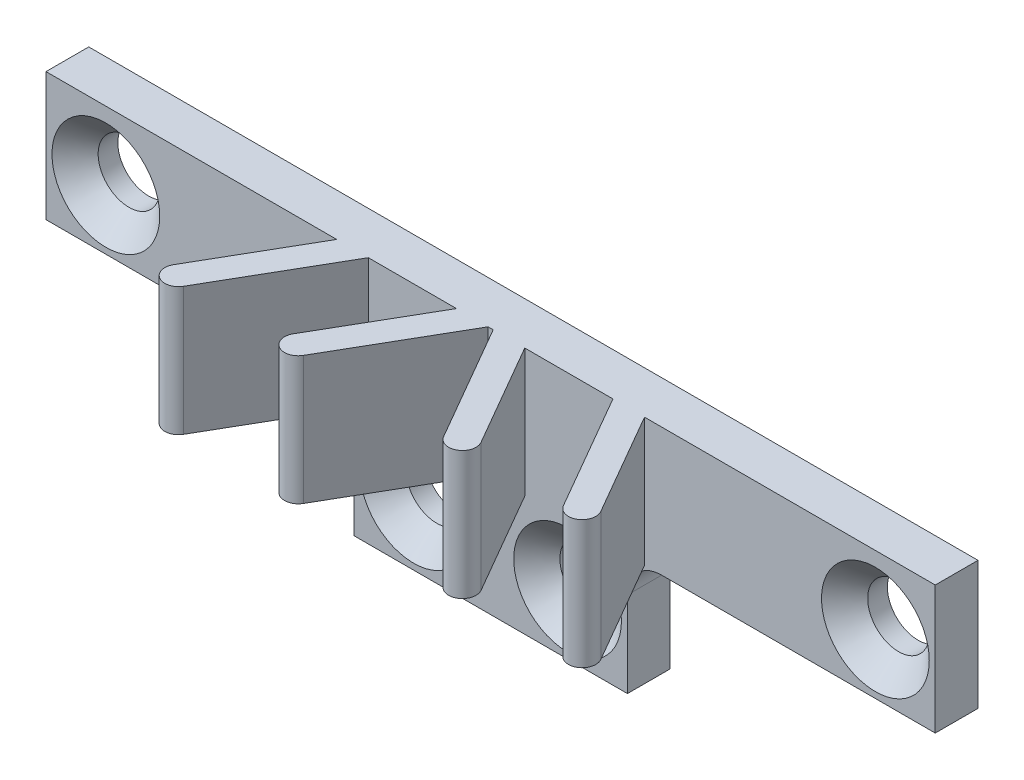
ISO-10303-21;
HEADER;
FILE_DESCRIPTION(('STEP AP214'),'2;1');
FILE_NAME('part.step','',(''),(''),'','','');
FILE_SCHEMA(('AUTOMOTIVE_DESIGN { 1 0 10303 214 1 1 1 1 }'));
ENDSEC;
DATA;
#1=APPLICATION_CONTEXT('core data for automotive mechanical design processes');
#2=APPLICATION_PROTOCOL_DEFINITION('international standard','automotive_design',2000,#1);
#3=PRODUCT_CONTEXT('',#1,'mechanical');
#4=PRODUCT('Part','Part','',(#3));
#5=PRODUCT_RELATED_PRODUCT_CATEGORY('part','',(#4));
#6=PRODUCT_DEFINITION_FORMATION('','',#4);
#7=PRODUCT_DEFINITION_CONTEXT('part definition',#1,'design');
#8=PRODUCT_DEFINITION('design','',#6,#7);
#9=PRODUCT_DEFINITION_SHAPE('','',#8);
#10=(LENGTH_UNIT() NAMED_UNIT(*) SI_UNIT(.MILLI.,.METRE.));
#11=(NAMED_UNIT(*) PLANE_ANGLE_UNIT() SI_UNIT($,.RADIAN.));
#12=(NAMED_UNIT(*) SI_UNIT($,.STERADIAN.) SOLID_ANGLE_UNIT());
#13=UNCERTAINTY_MEASURE_WITH_UNIT(LENGTH_MEASURE(1.E-05),#10,'distance_accuracy_value','');
#14=(GEOMETRIC_REPRESENTATION_CONTEXT(3) GLOBAL_UNCERTAINTY_ASSIGNED_CONTEXT((#13)) GLOBAL_UNIT_ASSIGNED_CONTEXT((#10,
#11,#12)) REPRESENTATION_CONTEXT('',''));
#15=CARTESIAN_POINT('',(0.,0.,0.));
#16=DIRECTION('',(0.,0.,1.));
#17=DIRECTION('',(1.,0.,0.));
#18=AXIS2_PLACEMENT_3D('',#15,#16,#17);
#19=CARTESIAN_POINT('',(-8.,-0.25,5.));
#20=DIRECTION('',(0.,1.,0.));
#21=DIRECTION('',(-1.,0.,0.));
#22=AXIS2_PLACEMENT_3D('',#19,#20,#21);
#23=PLANE('',#22);
#24=DIRECTION('',(-0.500000000000004,0.,-0.866025403784436));
#25=VECTOR('',#24,1.);
#26=CARTESIAN_POINT('',(6.44689110867542,-0.250000000000007,-3.72211431703));
#27=LINE('',#26,#25);
#28=CARTESIAN_POINT('',(11.1076061575154,-0.250000000000007,4.35048094716167));
#29=VERTEX_POINT('',#28);
#30=CARTESIAN_POINT('',(7.15247913859319,-0.250000000000007,-2.5));
#31=VERTEX_POINT('',#30);
#32=EDGE_CURVE('E470',#29,#31,#27,.T.);
#33=ORIENTED_EDGE('',*,*,#32,.T.);
#34=DIRECTION('',(-1.,0.,0.));
#35=VECTOR('',#34,1.);
#36=CARTESIAN_POINT('',(-8.,-0.25,-2.5));
#37=LINE('',#36,#35);
#38=CARTESIAN_POINT('',(9.,-0.250000000000003,-2.5));
#39=VERTEX_POINT('',#38);
#40=EDGE_CURVE('E349',#39,#31,#37,.T.);
#41=ORIENTED_EDGE('',*,*,#40,.F.);
#42=DIRECTION('',(0.500000000000005,0.,0.866025403784436));
#43=VECTOR('',#42,1.);
#44=CARTESIAN_POINT('',(7.83253175473051,-0.250000000000007,-4.52211431703));
#45=LINE('',#44,#43);
#46=CARTESIAN_POINT('',(12.4932468035705,-0.250000000000009,3.55048094716165));
#47=VERTEX_POINT('',#46);
#48=EDGE_CURVE('E464',#39,#47,#45,.T.);
#49=ORIENTED_EDGE('',*,*,#48,.T.);
#50=CARTESIAN_POINT('',(11.800426480543,-0.250000000000007,3.95048094716166));
#51=DIRECTION('',(0.,1.,0.));
#52=DIRECTION('',(-1.,0.,0.));
#53=AXIS2_PLACEMENT_3D('',#50,#51,#52);
#54=CIRCLE('',#53,0.800000000000001);
#55=EDGE_CURVE('E500',#29,#47,#54,.T.);
#56=ORIENTED_EDGE('',*,*,#55,.F.);
#57=EDGE_LOOP('',(#33,#41,#49,#56));
#58=FACE_BOUND('',#57,.T.);
#59=ADVANCED_FACE('F39',(#58),#23,.F.);
#60=DIRECTION('',(1.,0.,0.));
#61=VECTOR('',#60,1.);
#62=CARTESIAN_POINT('',(26.,-0.249999999999997,-2.5));
#63=LINE('',#62,#61);
#64=CARTESIAN_POINT('',(10.,-0.250000000000003,-2.5));
#65=VERTEX_POINT('',#64);
#66=CARTESIAN_POINT('',(26.,-0.249999999999997,-2.5));
#67=VERTEX_POINT('',#66);
#68=EDGE_CURVE('E356',#65,#67,#63,.T.);
#69=ORIENTED_EDGE('',*,*,#68,.F.);
#70=DIRECTION('',(0.,0.,-1.));
#71=VECTOR('',#70,1.);
#72=CARTESIAN_POINT('',(10.,-0.250000000000006,-5.));
#73=LINE('',#72,#71);
#74=CARTESIAN_POINT('',(10.,-0.25,-5.));
#75=VERTEX_POINT('',#74);
#76=EDGE_CURVE('E407',#65,#75,#73,.T.);
#77=ORIENTED_EDGE('',*,*,#76,.T.);
#78=DIRECTION('',(1.,0.,0.));
#79=VECTOR('',#78,1.);
#80=CARTESIAN_POINT('',(8.,-0.25,-5.));
#81=LINE('',#80,#79);
#82=CARTESIAN_POINT('',(26.,-0.249999999999995,-5.));
#83=VERTEX_POINT('',#82);
#84=EDGE_CURVE('E343',#75,#83,#81,.T.);
#85=ORIENTED_EDGE('',*,*,#84,.T.);
#86=DIRECTION('',(0.,0.,-1.));
#87=VECTOR('',#86,1.);
#88=CARTESIAN_POINT('',(26.,-0.249999999999995,5.));
#89=LINE('',#88,#87);
#90=EDGE_CURVE('E393',#67,#83,#89,.T.);
#91=ORIENTED_EDGE('',*,*,#90,.F.);
#92=EDGE_LOOP('',(#69,#77,#85,#91));
#93=FACE_BOUND('',#92,.T.);
#94=ADVANCED_FACE('F448',(#93),#23,.F.);
#95=CARTESIAN_POINT('',(-11.800426480543,-0.25,3.95048094716166));
#96=DIRECTION('',(0.,1.,0.));
#97=DIRECTION('',(-1.,0.,0.));
#98=AXIS2_PLACEMENT_3D('',#95,#96,#97);
#99=CIRCLE('',#98,0.800000000000002);
#100=CARTESIAN_POINT('',(-11.1076061575154,-0.249999999999999,4.35048094716167));
#101=VERTEX_POINT('',#100);
#102=CARTESIAN_POINT('',(-12.4932468035705,-0.25,3.55048094716166));
#103=VERTEX_POINT('',#102);
#104=EDGE_CURVE('E490',#101,#103,#99,.F.);
#105=ORIENTED_EDGE('',*,*,#104,.T.);
#106=DIRECTION('',(-0.500000000000004,0.,0.866025403784436));
#107=VECTOR('',#106,1.);
#108=CARTESIAN_POINT('',(-7.83253175473051,-0.25,-4.52211431703001));
#109=LINE('',#108,#107);
#110=CARTESIAN_POINT('',(-9.,-0.25,-2.5));
#111=VERTEX_POINT('',#110);
#112=EDGE_CURVE('E497',#111,#103,#109,.T.);
#113=ORIENTED_EDGE('',*,*,#112,.F.);
#114=CARTESIAN_POINT('',(-7.15247913859319,-0.249999999999998,-2.5));
#115=VERTEX_POINT('',#114);
#116=EDGE_CURVE('E344',#115,#111,#37,.T.);
#117=ORIENTED_EDGE('',*,*,#116,.F.);
#118=DIRECTION('',(0.500000000000004,0.,-0.866025403784436));
#119=VECTOR('',#118,1.);
#120=CARTESIAN_POINT('',(-6.44689110867542,-0.25,-3.72211431703));
#121=LINE('',#120,#119);
#122=EDGE_CURVE('E488',#101,#115,#121,.T.);
#123=ORIENTED_EDGE('',*,*,#122,.F.);
#124=EDGE_LOOP('',(#105,#113,#117,#123));
#125=FACE_BOUND('',#124,.T.);
#126=ADVANCED_FACE('F523',(#125),#23,.F.);
#127=CARTESIAN_POINT('',(-4.79794734194972,-0.25,3.95048094716167));
#128=DIRECTION('',(0.,1.,0.));
#129=DIRECTION('',(-1.,0.,0.));
#130=AXIS2_PLACEMENT_3D('',#127,#128,#129);
#131=CIRCLE('',#130,0.799999999999999);
#132=CARTESIAN_POINT('',(-5.49076766497727,-0.25,3.55048094716168));
#133=VERTEX_POINT('',#132);
#134=CARTESIAN_POINT('',(-4.10512701892217,-0.249999999999999,4.35048094716167));
#135=VERTEX_POINT('',#134);
#136=EDGE_CURVE('E485',#133,#135,#131,.T.);
#137=ORIENTED_EDGE('',*,*,#136,.F.);
#138=DIRECTION('',(-0.499999999999998,0.,0.86602540378444));
#139=VECTOR('',#138,1.);
#140=CARTESIAN_POINT('',(-2.58067240078564,-0.25,-1.48995190528383));
#141=LINE('',#140,#139);
#142=CARTESIAN_POINT('',(-1.9975208614068,-0.25,-2.5));
#143=VERTEX_POINT('',#142);
#144=EDGE_CURVE('E484',#143,#133,#141,.T.);
#145=ORIENTED_EDGE('',*,*,#144,.F.);
#146=CARTESIAN_POINT('',(-0.150000000000001,-0.25,-2.5));
#147=VERTEX_POINT('',#146);
#148=EDGE_CURVE('E347',#147,#143,#37,.T.);
#149=ORIENTED_EDGE('',*,*,#148,.F.);
#150=DIRECTION('',(0.499999999999998,0.,-0.86602540378444));
#151=VECTOR('',#150,1.);
#152=CARTESIAN_POINT('',(-1.19503175473054,-0.25,-0.689951905283832));
#153=LINE('',#152,#151);
#154=EDGE_CURVE('E483',#135,#147,#153,.T.);
#155=ORIENTED_EDGE('',*,*,#154,.F.);
#156=EDGE_LOOP('',(#137,#145,#149,#155));
#157=FACE_BOUND('',#156,.T.);
#158=ADVANCED_FACE('F482',(#157),#23,.F.);
#159=CARTESIAN_POINT('',(1.9975208614068,-0.250000000000001,-2.5));
#160=VERTEX_POINT('',#159);
#161=CARTESIAN_POINT('',(0.149999999999999,-0.25,-2.49999999999999));
#162=VERTEX_POINT('',#161);
#163=EDGE_CURVE('E471',#160,#162,#37,.T.);
#164=ORIENTED_EDGE('',*,*,#163,.F.);
#165=DIRECTION('',(-0.499999999999998,0.,-0.86602540378444));
#166=VECTOR('',#165,1.);
#167=CARTESIAN_POINT('',(2.58067240078565,-0.25,-1.48995190528382));
#168=LINE('',#167,#166);
#169=CARTESIAN_POINT('',(5.49076766497727,-0.250000000000007,3.55048094716167));
#170=VERTEX_POINT('',#169);
#171=EDGE_CURVE('E308',#170,#160,#168,.T.);
#172=ORIENTED_EDGE('',*,*,#171,.F.);
#173=CARTESIAN_POINT('',(4.79794734194972,-0.250000000000007,3.95048094716167));
#174=DIRECTION('',(0.,1.,0.));
#175=DIRECTION('',(-1.,0.,0.));
#176=AXIS2_PLACEMENT_3D('',#173,#174,#175);
#177=CIRCLE('',#176,0.800000000000001);
#178=CARTESIAN_POINT('',(4.10512701892217,-0.250000000000007,4.35048094716167));
#179=VERTEX_POINT('',#178);
#180=EDGE_CURVE('E218',#179,#170,#177,.T.);
#181=ORIENTED_EDGE('',*,*,#180,.F.);
#182=DIRECTION('',(0.499999999999998,0.,0.86602540378444));
#183=VECTOR('',#182,1.);
#184=CARTESIAN_POINT('',(1.19503175473055,-0.25,-0.689951905283821));
#185=LINE('',#184,#183);
#186=EDGE_CURVE('E276',#162,#179,#185,.T.);
#187=ORIENTED_EDGE('',*,*,#186,.F.);
#188=EDGE_LOOP('',(#164,#172,#181,#187));
#189=FACE_BOUND('',#188,.T.);
#190=ADVANCED_FACE('F504',(#189),#23,.F.);
#191=CARTESIAN_POINT('',(-26.,-0.249999999999995,5.));
#192=DIRECTION('',(1.,0.,0.));
#193=DIRECTION('',(0.,0.,-1.));
#194=AXIS2_PLACEMENT_3D('',#191,#192,#193);
#195=PLANE('',#194);
#196=DIRECTION('',(0.,-1.,0.));
#197=VECTOR('',#196,1.);
#198=CARTESIAN_POINT('',(-26.,7.25,-2.5));
#199=LINE('',#198,#197);
#200=CARTESIAN_POINT('',(-26.,7.25,-2.5));
#201=VERTEX_POINT('',#200);
#202=CARTESIAN_POINT('',(-26.,-0.249999999999995,-2.5));
#203=VERTEX_POINT('',#202);
#204=EDGE_CURVE('E336',#201,#203,#199,.T.);
#205=ORIENTED_EDGE('',*,*,#204,.F.);
#206=DIRECTION('',(0.,0.,-1.));
#207=VECTOR('',#206,1.);
#208=CARTESIAN_POINT('',(-26.,7.25,5.));
#209=LINE('',#208,#207);
#210=CARTESIAN_POINT('',(-26.,7.25,-5.));
#211=VERTEX_POINT('',#210);
#212=EDGE_CURVE('E389',#201,#211,#209,.T.);
#213=ORIENTED_EDGE('',*,*,#212,.T.);
#214=DIRECTION('',(0.,-1.,0.));
#215=VECTOR('',#214,1.);
#216=CARTESIAN_POINT('',(-26.,-0.249999999999995,-5.));
#217=LINE('',#216,#215);
#218=CARTESIAN_POINT('',(-26.,-0.249999999999995,-5.));
#219=VERTEX_POINT('',#218);
#220=EDGE_CURVE('E368',#211,#219,#217,.T.);
#221=ORIENTED_EDGE('',*,*,#220,.T.);
#222=DIRECTION('',(0.,0.,-1.));
#223=VECTOR('',#222,1.);
#224=CARTESIAN_POINT('',(-26.,-0.249999999999995,5.));
#225=LINE('',#224,#223);
#226=EDGE_CURVE('E387',#203,#219,#225,.T.);
#227=ORIENTED_EDGE('',*,*,#226,.F.);
#228=EDGE_LOOP('',(#205,#213,#221,#227));
#229=FACE_BOUND('',#228,.T.);
#230=ADVANCED_FACE('F535',(#229),#195,.F.);
#231=CARTESIAN_POINT('',(-8.,-7.25,5.));
#232=DIRECTION('',(1.,0.,0.));
#233=DIRECTION('',(0.,0.,-1.));
#234=AXIS2_PLACEMENT_3D('',#231,#232,#233);
#235=PLANE('',#234);
#236=DIRECTION('',(0.,-1.,0.));
#237=VECTOR('',#236,1.);
#238=CARTESIAN_POINT('',(-8.,-0.25,-2.5));
#239=LINE('',#238,#237);
#240=CARTESIAN_POINT('',(-8.,-2.25,-2.5));
#241=VERTEX_POINT('',#240);
#242=CARTESIAN_POINT('',(-8.,-7.25,-2.5));
#243=VERTEX_POINT('',#242);
#244=EDGE_CURVE('E339',#241,#243,#239,.T.);
#245=ORIENTED_EDGE('',*,*,#244,.F.);
#246=DIRECTION('',(0.,0.,-1.));
#247=VECTOR('',#246,1.);
#248=CARTESIAN_POINT('',(-8.,-2.25,-5.));
#249=LINE('',#248,#247);
#250=CARTESIAN_POINT('',(-8.,-2.25,-5.));
#251=VERTEX_POINT('',#250);
#252=EDGE_CURVE('E412',#241,#251,#249,.T.);
#253=ORIENTED_EDGE('',*,*,#252,.T.);
#254=DIRECTION('',(0.,-1.,0.));
#255=VECTOR('',#254,1.);
#256=CARTESIAN_POINT('',(-8.,-7.25,-5.));
#257=LINE('',#256,#255);
#258=CARTESIAN_POINT('',(-8.,-7.25,-5.));
#259=VERTEX_POINT('',#258);
#260=EDGE_CURVE('E374',#251,#259,#257,.T.);
#261=ORIENTED_EDGE('',*,*,#260,.T.);
#262=DIRECTION('',(0.,0.,-1.));
#263=VECTOR('',#262,1.);
#264=CARTESIAN_POINT('',(-8.,-7.25,5.));
#265=LINE('',#264,#263);
#266=EDGE_CURVE('E384',#243,#259,#265,.T.);
#267=ORIENTED_EDGE('',*,*,#266,.F.);
#268=EDGE_LOOP('',(#245,#253,#261,#267));
#269=FACE_BOUND('',#268,.T.);
#270=ADVANCED_FACE('F430',(#269),#235,.F.);
#271=CARTESIAN_POINT('',(8.,-7.25,5.));
#272=DIRECTION('',(0.,1.,0.));
#273=DIRECTION('',(0.,0.,1.));
#274=AXIS2_PLACEMENT_3D('',#271,#272,#273);
#275=PLANE('',#274);
#276=DIRECTION('',(1.,0.,0.));
#277=VECTOR('',#276,1.);
#278=CARTESIAN_POINT('',(-8.,-7.25,-2.5));
#279=LINE('',#278,#277);
#280=CARTESIAN_POINT('',(8.,-7.25,-2.5));
#281=VERTEX_POINT('',#280);
#282=EDGE_CURVE('E353',#243,#281,#279,.T.);
#283=ORIENTED_EDGE('',*,*,#282,.F.);
#284=ORIENTED_EDGE('',*,*,#266,.T.);
#285=DIRECTION('',(1.,0.,0.));
#286=VECTOR('',#285,1.);
#287=CARTESIAN_POINT('',(8.,-7.25,-5.));
#288=LINE('',#287,#286);
#289=CARTESIAN_POINT('',(8.,-7.25,-5.));
#290=VERTEX_POINT('',#289);
#291=EDGE_CURVE('E376',#259,#290,#288,.T.);
#292=ORIENTED_EDGE('',*,*,#291,.T.);
#293=DIRECTION('',(0.,0.,-1.));
#294=VECTOR('',#293,1.);
#295=CARTESIAN_POINT('',(8.,-7.25,5.));
#296=LINE('',#295,#294);
#297=EDGE_CURVE('E382',#281,#290,#296,.T.);
#298=ORIENTED_EDGE('',*,*,#297,.F.);
#299=EDGE_LOOP('',(#283,#284,#292,#298));
#300=FACE_BOUND('',#299,.T.);
#301=ADVANCED_FACE('F438',(#300),#275,.F.);
#302=CARTESIAN_POINT('',(8.,-7.25,5.));
#303=DIRECTION('',(-1.,0.,0.));
#304=DIRECTION('',(0.,0.,1.));
#305=AXIS2_PLACEMENT_3D('',#302,#303,#304);
#306=PLANE('',#305);
#307=DIRECTION('',(0.,1.,0.));
#308=VECTOR('',#307,1.);
#309=CARTESIAN_POINT('',(8.,-7.25,-5.));
#310=LINE('',#309,#308);
#311=CARTESIAN_POINT('',(8.,-2.25000000000001,-5.));
#312=VERTEX_POINT('',#311);
#313=EDGE_CURVE('E379',#290,#312,#310,.T.);
#314=ORIENTED_EDGE('',*,*,#313,.T.);
#315=DIRECTION('',(0.,0.,-1.));
#316=VECTOR('',#315,1.);
#317=CARTESIAN_POINT('',(8.,-2.25000000000001,-2.5));
#318=LINE('',#317,#316);
#319=CARTESIAN_POINT('',(8.,-2.25000000000001,-2.5));
#320=VERTEX_POINT('',#319);
#321=EDGE_CURVE('E410',#312,#320,#318,.F.);
#322=ORIENTED_EDGE('',*,*,#321,.T.);
#323=DIRECTION('',(0.,1.,0.));
#324=VECTOR('',#323,1.);
#325=CARTESIAN_POINT('',(8.,-0.25,-2.5));
#326=LINE('',#325,#324);
#327=EDGE_CURVE('E350',#281,#320,#326,.T.);
#328=ORIENTED_EDGE('',*,*,#327,.F.);
#329=ORIENTED_EDGE('',*,*,#297,.T.);
#330=EDGE_LOOP('',(#314,#322,#328,#329));
#331=FACE_BOUND('',#330,.T.);
#332=ADVANCED_FACE('F441',(#331),#306,.F.);
#333=CARTESIAN_POINT('',(26.,7.25,5.));
#334=DIRECTION('',(-1.,0.,0.));
#335=DIRECTION('',(0.,0.,1.));
#336=AXIS2_PLACEMENT_3D('',#333,#334,#335);
#337=PLANE('',#336);
#338=DIRECTION('',(0.,0.,-1.));
#339=VECTOR('',#338,1.);
#340=CARTESIAN_POINT('',(26.,7.25,5.));
#341=LINE('',#340,#339);
#342=CARTESIAN_POINT('',(26.,7.25,-2.5));
#343=VERTEX_POINT('',#342);
#344=CARTESIAN_POINT('',(26.,7.25,-5.));
#345=VERTEX_POINT('',#344);
#346=EDGE_CURVE('E391',#343,#345,#341,.T.);
#347=ORIENTED_EDGE('',*,*,#346,.F.);
#348=DIRECTION('',(0.,1.,0.));
#349=VECTOR('',#348,1.);
#350=CARTESIAN_POINT('',(26.,7.25,-2.5));
#351=LINE('',#350,#349);
#352=EDGE_CURVE('E348',#67,#343,#351,.T.);
#353=ORIENTED_EDGE('',*,*,#352,.F.);
#354=ORIENTED_EDGE('',*,*,#90,.T.);
#355=DIRECTION('',(0.,1.,0.));
#356=VECTOR('',#355,1.);
#357=CARTESIAN_POINT('',(26.,7.25,-5.));
#358=LINE('',#357,#356);
#359=EDGE_CURVE('E362',#83,#345,#358,.T.);
#360=ORIENTED_EDGE('',*,*,#359,.T.);
#361=EDGE_LOOP('',(#347,#353,#354,#360));
#362=FACE_BOUND('',#361,.T.);
#363=ADVANCED_FACE('F454',(#362),#337,.F.);
#364=CARTESIAN_POINT('',(-26.,7.25,5.));
#365=DIRECTION('',(0.,-1.,0.));
#366=DIRECTION('',(0.,0.,-1.));
#367=AXIS2_PLACEMENT_3D('',#364,#365,#366);
#368=PLANE('',#367);
#369=DIRECTION('',(-0.500000000000005,0.,-0.866025403784436));
#370=VECTOR('',#369,1.);
#371=CARTESIAN_POINT('',(7.83253175473051,7.25,-4.52211431703001));
#372=LINE('',#371,#370);
#373=CARTESIAN_POINT('',(12.4932468035705,7.25,3.55048094716165));
#374=VERTEX_POINT('',#373);
#375=CARTESIAN_POINT('',(9.,7.25,-2.5));
#376=VERTEX_POINT('',#375);
#377=EDGE_CURVE('E266',#374,#376,#372,.T.);
#378=ORIENTED_EDGE('',*,*,#377,.T.);
#379=DIRECTION('',(-1.,0.,0.));
#380=VECTOR('',#379,1.);
#381=CARTESIAN_POINT('',(26.,7.25,-2.5));
#382=LINE('',#381,#380);
#383=EDGE_CURVE('E358',#343,#376,#382,.T.);
#384=ORIENTED_EDGE('',*,*,#383,.F.);
#385=ORIENTED_EDGE('',*,*,#346,.T.);
#386=DIRECTION('',(-1.,0.,0.));
#387=VECTOR('',#386,1.);
#388=CARTESIAN_POINT('',(-26.,7.25,-5.));
#389=LINE('',#388,#387);
#390=EDGE_CURVE('E365',#345,#211,#389,.T.);
#391=ORIENTED_EDGE('',*,*,#390,.T.);
#392=ORIENTED_EDGE('',*,*,#212,.F.);
#393=DIRECTION('',(-1.,0.,0.));
#394=VECTOR('',#393,1.);
#395=CARTESIAN_POINT('',(-26.,7.25,-2.5));
#396=LINE('',#395,#394);
#397=CARTESIAN_POINT('',(-9.,7.25,-2.5));
#398=VERTEX_POINT('',#397);
#399=EDGE_CURVE('E341',#398,#201,#396,.T.);
#400=ORIENTED_EDGE('',*,*,#399,.F.);
#401=DIRECTION('',(0.500000000000004,0.,-0.866025403784436));
#402=VECTOR('',#401,1.);
#403=CARTESIAN_POINT('',(-7.83253175473052,7.25,-4.52211431703001));
#404=LINE('',#403,#402);
#405=CARTESIAN_POINT('',(-12.4932468035705,7.25,3.55048094716166));
#406=VERTEX_POINT('',#405);
#407=EDGE_CURVE('E263',#406,#398,#404,.T.);
#408=ORIENTED_EDGE('',*,*,#407,.F.);
#409=CARTESIAN_POINT('',(-11.800426480543,7.25,3.95048094716166));
#410=DIRECTION('',(0.,1.,0.));
#411=DIRECTION('',(0.,0.,1.));
#412=AXIS2_PLACEMENT_3D('',#409,#410,#411);
#413=CIRCLE('',#412,0.800000000000002);
#414=CARTESIAN_POINT('',(-11.1076061575154,7.25,4.35048094716167));
#415=VERTEX_POINT('',#414);
#416=EDGE_CURVE('E260',#406,#415,#413,.T.);
#417=ORIENTED_EDGE('',*,*,#416,.T.);
#418=DIRECTION('',(-0.500000000000004,0.,0.866025403784436));
#419=VECTOR('',#418,1.);
#420=CARTESIAN_POINT('',(-6.44689110867542,7.25,-3.72211431703));
#421=LINE('',#420,#419);
#422=CARTESIAN_POINT('',(-7.15247913859319,7.25,-2.5));
#423=VERTEX_POINT('',#422);
#424=EDGE_CURVE('E257',#423,#415,#421,.T.);
#425=ORIENTED_EDGE('',*,*,#424,.F.);
#426=DIRECTION('',(1.,0.,0.));
#427=VECTOR('',#426,1.);
#428=CARTESIAN_POINT('',(0.,7.25,-2.5));
#429=LINE('',#428,#427);
#430=CARTESIAN_POINT('',(-1.9975208614068,7.25,-2.5));
#431=VERTEX_POINT('',#430);
#432=EDGE_CURVE('E254',#423,#431,#429,.T.);
#433=ORIENTED_EDGE('',*,*,#432,.T.);
#434=DIRECTION('',(0.499999999999998,0.,-0.86602540378444));
#435=VECTOR('',#434,1.);
#436=CARTESIAN_POINT('',(-2.58067240078565,7.25,-1.48995190528382));
#437=LINE('',#436,#435);
#438=CARTESIAN_POINT('',(-5.49076766497727,7.25,3.55048094716168));
#439=VERTEX_POINT('',#438);
#440=EDGE_CURVE('E251',#439,#431,#437,.T.);
#441=ORIENTED_EDGE('',*,*,#440,.F.);
#442=CARTESIAN_POINT('',(-4.79794734194972,7.25,3.95048094716167));
#443=DIRECTION('',(0.,1.,0.));
#444=DIRECTION('',(0.,0.,1.));
#445=AXIS2_PLACEMENT_3D('',#442,#443,#444);
#446=CIRCLE('',#445,0.799999999999999);
#447=CARTESIAN_POINT('',(-4.10512701892217,7.25,4.35048094716167));
#448=VERTEX_POINT('',#447);
#449=EDGE_CURVE('E248',#448,#439,#446,.F.);
#450=ORIENTED_EDGE('',*,*,#449,.F.);
#451=DIRECTION('',(-0.499999999999998,0.,0.86602540378444));
#452=VECTOR('',#451,1.);
#453=CARTESIAN_POINT('',(-1.19503175473055,7.25,-0.689951905283827));
#454=LINE('',#453,#452);
#455=CARTESIAN_POINT('',(-0.150000000000001,7.25,-2.5));
#456=VERTEX_POINT('',#455);
#457=EDGE_CURVE('E245',#456,#448,#454,.T.);
#458=ORIENTED_EDGE('',*,*,#457,.F.);
#459=DIRECTION('',(-1.,0.,0.));
#460=VECTOR('',#459,1.);
#461=CARTESIAN_POINT('',(0.,7.25,-2.5));
#462=LINE('',#461,#460);
#463=CARTESIAN_POINT('',(0.15,7.25,-2.49999999999999));
#464=VERTEX_POINT('',#463);
#465=EDGE_CURVE('E239',#464,#456,#462,.T.);
#466=ORIENTED_EDGE('',*,*,#465,.F.);
#467=DIRECTION('',(-0.499999999999998,0.,-0.86602540378444));
#468=VECTOR('',#467,1.);
#469=CARTESIAN_POINT('',(1.19503175473054,7.25,-0.689951905283826));
#470=LINE('',#469,#468);
#471=CARTESIAN_POINT('',(4.10512701892217,7.25,4.35048094716167));
#472=VERTEX_POINT('',#471);
#473=EDGE_CURVE('E237',#472,#464,#470,.T.);
#474=ORIENTED_EDGE('',*,*,#473,.F.);
#475=CARTESIAN_POINT('',(4.79794734194972,7.25,3.95048094716167));
#476=DIRECTION('',(0.,1.,0.));
#477=DIRECTION('',(0.,0.,1.));
#478=AXIS2_PLACEMENT_3D('',#475,#476,#477);
#479=CIRCLE('',#478,0.800000000000001);
#480=CARTESIAN_POINT('',(5.49076766497727,7.25,3.55048094716167));
#481=VERTEX_POINT('',#480);
#482=EDGE_CURVE('E215',#481,#472,#479,.F.);
#483=ORIENTED_EDGE('',*,*,#482,.F.);
#484=DIRECTION('',(0.499999999999998,0.,0.86602540378444));
#485=VECTOR('',#484,1.);
#486=CARTESIAN_POINT('',(2.58067240078565,7.25,-1.48995190528382));
#487=LINE('',#486,#485);
#488=CARTESIAN_POINT('',(1.9975208614068,7.25,-2.5));
#489=VERTEX_POINT('',#488);
#490=EDGE_CURVE('E225',#489,#481,#487,.T.);
#491=ORIENTED_EDGE('',*,*,#490,.F.);
#492=DIRECTION('',(-1.,0.,0.));
#493=VECTOR('',#492,1.);
#494=CARTESIAN_POINT('',(0.,7.25,-2.5));
#495=LINE('',#494,#493);
#496=CARTESIAN_POINT('',(7.15247913859319,7.25,-2.5));
#497=VERTEX_POINT('',#496);
#498=EDGE_CURVE('E222',#497,#489,#495,.T.);
#499=ORIENTED_EDGE('',*,*,#498,.F.);
#500=DIRECTION('',(0.500000000000004,0.,0.866025403784436));
#501=VECTOR('',#500,1.);
#502=CARTESIAN_POINT('',(6.44689110867542,7.25,-3.72211431703));
#503=LINE('',#502,#501);
#504=CARTESIAN_POINT('',(11.1076061575154,7.25,4.35048094716167));
#505=VERTEX_POINT('',#504);
#506=EDGE_CURVE('E271',#497,#505,#503,.T.);
#507=ORIENTED_EDGE('',*,*,#506,.T.);
#508=CARTESIAN_POINT('',(11.800426480543,7.25,3.95048094716166));
#509=DIRECTION('',(0.,1.,0.));
#510=DIRECTION('',(0.,0.,1.));
#511=AXIS2_PLACEMENT_3D('',#508,#509,#510);
#512=CIRCLE('',#511,0.800000000000001);
#513=EDGE_CURVE('E268',#374,#505,#512,.F.);
#514=ORIENTED_EDGE('',*,*,#513,.F.);
#515=EDGE_LOOP('',(#378,#384,#385,#391,#392,#400,#408,#417,#425,#433,#441,#450,#458,#466,#474,
#483,#491,#499,#507,#514));
#516=FACE_BOUND('',#515,.T.);
#517=ADVANCED_FACE('F234',(#516),#368,.F.);
#518=DIRECTION('',(0.,0.,-1.));
#519=VECTOR('',#518,1.);
#520=CARTESIAN_POINT('',(-10.,-0.25,-2.5));
#521=LINE('',#520,#519);
#522=CARTESIAN_POINT('',(-10.,-0.25,-5.));
#523=VERTEX_POINT('',#522);
#524=CARTESIAN_POINT('',(-10.,-0.249999999999997,-2.5));
#525=VERTEX_POINT('',#524);
#526=EDGE_CURVE('E396',#523,#525,#521,.F.);
#527=ORIENTED_EDGE('',*,*,#526,.T.);
#528=DIRECTION('',(1.,0.,0.));
#529=VECTOR('',#528,1.);
#530=CARTESIAN_POINT('',(-26.,-0.249999999999995,-2.5));
#531=LINE('',#530,#529);
#532=EDGE_CURVE('E338',#203,#525,#531,.T.);
#533=ORIENTED_EDGE('',*,*,#532,.F.);
#534=ORIENTED_EDGE('',*,*,#226,.T.);
#535=DIRECTION('',(1.,0.,0.));
#536=VECTOR('',#535,1.);
#537=CARTESIAN_POINT('',(-8.,-0.25,-5.));
#538=LINE('',#537,#536);
#539=EDGE_CURVE('E371',#219,#523,#538,.T.);
#540=ORIENTED_EDGE('',*,*,#539,.T.);
#541=EDGE_LOOP('',(#527,#533,#534,#540));
#542=FACE_BOUND('',#541,.T.);
#543=ADVANCED_FACE('F426',(#542),#23,.F.);
#544=CARTESIAN_POINT('',(0.,0.,-5.));
#545=DIRECTION('',(0.,0.,-1.));
#546=DIRECTION('',(-1.,0.,0.));
#547=AXIS2_PLACEMENT_3D('',#544,#545,#546);
#548=PLANE('',#547);
#549=CARTESIAN_POINT('',(-4.5,-3.75,-5.));
#550=DIRECTION('',(0.,0.,-1.));
#551=DIRECTION('',(-1.,0.,0.));
#552=AXIS2_PLACEMENT_3D('',#549,#550,#551);
#553=CIRCLE('',#552,1.8);
#554=CARTESIAN_POINT('',(-6.3,-3.75,-5.));
#555=VERTEX_POINT('',#554);
#556=EDGE_CURVE('E314',#555,#555,#553,.T.);
#557=ORIENTED_EDGE('',*,*,#556,.F.);
#558=EDGE_LOOP('',(#557));
#559=FACE_BOUND('',#558,.T.);
#560=CARTESIAN_POINT('',(4.5,-3.75,-5.));
#561=DIRECTION('',(0.,0.,-1.));
#562=DIRECTION('',(-1.,0.,0.));
#563=AXIS2_PLACEMENT_3D('',#560,#561,#562);
#564=CIRCLE('',#563,1.8);
#565=CARTESIAN_POINT('',(2.7,-3.75,-5.));
#566=VERTEX_POINT('',#565);
#567=EDGE_CURVE('E321',#566,#566,#564,.T.);
#568=ORIENTED_EDGE('',*,*,#567,.F.);
#569=EDGE_LOOP('',(#568));
#570=FACE_BOUND('',#569,.T.);
#571=CARTESIAN_POINT('',(-22.5,3.25,-5.));
#572=DIRECTION('',(0.,0.,-1.));
#573=DIRECTION('',(-1.,0.,0.));
#574=AXIS2_PLACEMENT_3D('',#571,#572,#573);
#575=CIRCLE('',#574,1.8);
#576=CARTESIAN_POINT('',(-24.3,3.25,-5.));
#577=VERTEX_POINT('',#576);
#578=EDGE_CURVE('E328',#577,#577,#575,.T.);
#579=ORIENTED_EDGE('',*,*,#578,.F.);
#580=EDGE_LOOP('',(#579));
#581=FACE_BOUND('',#580,.T.);
#582=CARTESIAN_POINT('',(22.5,3.25,-5.));
#583=DIRECTION('',(0.,0.,-1.));
#584=DIRECTION('',(-1.,0.,0.));
#585=AXIS2_PLACEMENT_3D('',#582,#583,#584);
#586=CIRCLE('',#585,1.8);
#587=CARTESIAN_POINT('',(20.7,3.25,-5.));
#588=VERTEX_POINT('',#587);
#589=EDGE_CURVE('E335',#588,#588,#586,.T.);
#590=ORIENTED_EDGE('',*,*,#589,.F.);
#591=EDGE_LOOP('',(#590));
#592=FACE_BOUND('',#591,.T.);
#593=ORIENTED_EDGE('',*,*,#84,.F.);
#594=CARTESIAN_POINT('',(10.,-2.25000000000001,-5.));
#595=DIRECTION('',(0.,0.,-1.));
#596=DIRECTION('',(-1.,0.,0.));
#597=AXIS2_PLACEMENT_3D('',#594,#595,#596);
#598=CIRCLE('',#597,2.);
#599=EDGE_CURVE('E414',#75,#312,#598,.F.);
#600=ORIENTED_EDGE('',*,*,#599,.T.);
#601=ORIENTED_EDGE('',*,*,#313,.F.);
#602=ORIENTED_EDGE('',*,*,#291,.F.);
#603=ORIENTED_EDGE('',*,*,#260,.F.);
#604=CARTESIAN_POINT('',(-10.,-2.25,-5.));
#605=DIRECTION('',(0.,0.,-1.));
#606=DIRECTION('',(-1.,0.,0.));
#607=AXIS2_PLACEMENT_3D('',#604,#605,#606);
#608=CIRCLE('',#607,2.);
#609=EDGE_CURVE('E47',#251,#523,#608,.F.);
#610=ORIENTED_EDGE('',*,*,#609,.T.);
#611=ORIENTED_EDGE('',*,*,#539,.F.);
#612=ORIENTED_EDGE('',*,*,#220,.F.);
#613=ORIENTED_EDGE('',*,*,#390,.F.);
#614=ORIENTED_EDGE('',*,*,#359,.F.);
#615=EDGE_LOOP('',(#593,#600,#601,#602,#603,#610,#611,#612,#613,#614));
#616=FACE_BOUND('',#615,.T.);
#617=ADVANCED_FACE('F422',(#559,#570,#581,#592,#616),#548,.T.);
#618=CARTESIAN_POINT('',(0.,0.,-2.5));
#619=DIRECTION('',(0.,0.,1.));
#620=DIRECTION('',(1.,0.,0.));
#621=AXIS2_PLACEMENT_3D('',#618,#619,#620);
#622=PLANE('',#621);
#623=CARTESIAN_POINT('',(-22.5,3.25,-2.5));
#624=DIRECTION('',(0.,0.,1.));
#625=DIRECTION('',(1.,0.,0.));
#626=AXIS2_PLACEMENT_3D('',#623,#624,#625);
#627=CIRCLE('',#626,3.15);
#628=CARTESIAN_POINT('',(-19.35,3.25,-2.5));
#629=VERTEX_POINT('',#628);
#630=EDGE_CURVE('E322',#629,#629,#627,.T.);
#631=ORIENTED_EDGE('',*,*,#630,.F.);
#632=EDGE_LOOP('',(#631));
#633=FACE_BOUND('',#632,.T.);
#634=ORIENTED_EDGE('',*,*,#204,.T.);
#635=ORIENTED_EDGE('',*,*,#532,.T.);
#636=CARTESIAN_POINT('',(-10.,-2.25,-2.5));
#637=DIRECTION('',(0.,0.,1.));
#638=DIRECTION('',(1.,0.,0.));
#639=AXIS2_PLACEMENT_3D('',#636,#637,#638);
#640=CIRCLE('',#639,2.);
#641=EDGE_CURVE('E11',#525,#241,#640,.F.);
#642=ORIENTED_EDGE('',*,*,#641,.T.);
#643=ORIENTED_EDGE('',*,*,#244,.T.);
#644=ORIENTED_EDGE('',*,*,#282,.T.);
#645=ORIENTED_EDGE('',*,*,#327,.T.);
#646=CARTESIAN_POINT('',(10.,-2.25000000000001,-2.5));
#647=DIRECTION('',(0.,0.,1.));
#648=DIRECTION('',(1.,0.,0.));
#649=AXIS2_PLACEMENT_3D('',#646,#647,#648);
#650=CIRCLE('',#649,2.);
#651=EDGE_CURVE('E416',#320,#65,#650,.F.);
#652=ORIENTED_EDGE('',*,*,#651,.T.);
#653=ORIENTED_EDGE('',*,*,#68,.T.);
#654=ORIENTED_EDGE('',*,*,#352,.T.);
#655=ORIENTED_EDGE('',*,*,#383,.T.);
#656=DIRECTION('',(0.,1.,0.));
#657=VECTOR('',#656,1.);
#658=CARTESIAN_POINT('',(9.,-38.9830608137286,-2.5));
#659=LINE('',#658,#657);
#660=EDGE_CURVE('E283',#39,#376,#659,.T.);
#661=ORIENTED_EDGE('',*,*,#660,.F.);
#662=ORIENTED_EDGE('',*,*,#40,.T.);
#663=DIRECTION('',(0.,1.,0.));
#664=VECTOR('',#663,1.);
#665=CARTESIAN_POINT('',(7.15247913859319,-38.9830608137286,-2.5));
#666=LINE('',#665,#664);
#667=EDGE_CURVE('E277',#31,#497,#666,.T.);
#668=ORIENTED_EDGE('',*,*,#667,.T.);
#669=ORIENTED_EDGE('',*,*,#498,.T.);
#670=DIRECTION('',(0.,1.,0.));
#671=VECTOR('',#670,1.);
#672=CARTESIAN_POINT('',(1.9975208614068,-38.9830608137286,-2.5));
#673=LINE('',#672,#671);
#674=EDGE_CURVE('E228',#160,#489,#673,.T.);
#675=ORIENTED_EDGE('',*,*,#674,.F.);
#676=ORIENTED_EDGE('',*,*,#163,.T.);
#677=DIRECTION('',(0.,1.,0.));
#678=VECTOR('',#677,1.);
#679=CARTESIAN_POINT('',(0.15,-38.9830608137286,-2.49999999999999));
#680=LINE('',#679,#678);
#681=EDGE_CURVE('E303',#162,#464,#680,.T.);
#682=ORIENTED_EDGE('',*,*,#681,.T.);
#683=ORIENTED_EDGE('',*,*,#465,.T.);
#684=DIRECTION('',(0.,1.,0.));
#685=VECTOR('',#684,1.);
#686=CARTESIAN_POINT('',(-0.150000000000001,-38.9830608137286,-2.5));
#687=LINE('',#686,#685);
#688=EDGE_CURVE('E301',#147,#456,#687,.T.);
#689=ORIENTED_EDGE('',*,*,#688,.F.);
#690=ORIENTED_EDGE('',*,*,#148,.T.);
#691=DIRECTION('',(0.,1.,0.));
#692=VECTOR('',#691,1.);
#693=CARTESIAN_POINT('',(-1.9975208614068,-38.9830608137286,-2.5));
#694=LINE('',#693,#692);
#695=EDGE_CURVE('E295',#143,#431,#694,.T.);
#696=ORIENTED_EDGE('',*,*,#695,.T.);
#697=ORIENTED_EDGE('',*,*,#432,.F.);
#698=DIRECTION('',(0.,1.,0.));
#699=VECTOR('',#698,1.);
#700=CARTESIAN_POINT('',(-7.15247913859319,-38.9830608137286,-2.5));
#701=LINE('',#700,#699);
#702=EDGE_CURVE('E293',#115,#423,#701,.T.);
#703=ORIENTED_EDGE('',*,*,#702,.F.);
#704=ORIENTED_EDGE('',*,*,#116,.T.);
#705=DIRECTION('',(0.,1.,0.));
#706=VECTOR('',#705,1.);
#707=CARTESIAN_POINT('',(-9.,-38.9830608137286,-2.5));
#708=LINE('',#707,#706);
#709=EDGE_CURVE('E286',#111,#398,#708,.T.);
#710=ORIENTED_EDGE('',*,*,#709,.T.);
#711=ORIENTED_EDGE('',*,*,#399,.T.);
#712=EDGE_LOOP('',(#634,#635,#642,#643,#644,#645,#652,#653,#654,#655,#661,#662,#668,#669,#675,
#676,#682,#683,#689,#690,#696,#697,#703,#704,#710,#711));
#713=FACE_BOUND('',#712,.T.);
#714=CARTESIAN_POINT('',(-4.5,-3.75,-2.5));
#715=DIRECTION('',(0.,0.,1.));
#716=DIRECTION('',(1.,0.,0.));
#717=AXIS2_PLACEMENT_3D('',#714,#715,#716);
#718=CIRCLE('',#717,3.15);
#719=CARTESIAN_POINT('',(-1.35,-3.75,-2.5));
#720=VERTEX_POINT('',#719);
#721=EDGE_CURVE('E307',#720,#720,#718,.T.);
#722=ORIENTED_EDGE('',*,*,#721,.F.);
#723=EDGE_LOOP('',(#722));
#724=FACE_BOUND('',#723,.T.);
#725=CARTESIAN_POINT('',(4.5,-3.75,-2.5));
#726=DIRECTION('',(0.,0.,1.));
#727=DIRECTION('',(1.,0.,0.));
#728=AXIS2_PLACEMENT_3D('',#725,#726,#727);
#729=CIRCLE('',#728,3.15);
#730=CARTESIAN_POINT('',(7.65,-3.75,-2.5));
#731=VERTEX_POINT('',#730);
#732=EDGE_CURVE('E315',#731,#731,#729,.T.);
#733=ORIENTED_EDGE('',*,*,#732,.F.);
#734=EDGE_LOOP('',(#733));
#735=FACE_BOUND('',#734,.T.);
#736=CARTESIAN_POINT('',(22.5,3.25,-2.5));
#737=DIRECTION('',(0.,0.,1.));
#738=DIRECTION('',(1.,0.,0.));
#739=AXIS2_PLACEMENT_3D('',#736,#737,#738);
#740=CIRCLE('',#739,3.15);
#741=CARTESIAN_POINT('',(25.65,3.25,-2.5));
#742=VERTEX_POINT('',#741);
#743=EDGE_CURVE('E329',#742,#742,#740,.T.);
#744=ORIENTED_EDGE('',*,*,#743,.F.);
#745=EDGE_LOOP('',(#744));
#746=FACE_BOUND('',#745,.T.);
#747=ADVANCED_FACE('F433',(#633,#713,#724,#735,#746),#622,.T.);
#748=CARTESIAN_POINT('',(22.5,3.25,-2.5));
#749=DIRECTION('',(0.,0.,1.));
#750=DIRECTION('',(1.,0.,0.));
#751=AXIS2_PLACEMENT_3D('',#748,#749,#750);
#752=CYLINDRICAL_SURFACE('',#751,1.8);
#753=ORIENTED_EDGE('',*,*,#589,.T.);
#754=EDGE_LOOP('',(#753));
#755=FACE_BOUND('',#754,.T.);
#756=CARTESIAN_POINT('',(22.5,3.25,-3.85));
#757=DIRECTION('',(0.,0.,1.));
#758=DIRECTION('',(1.,0.,0.));
#759=AXIS2_PLACEMENT_3D('',#756,#757,#758);
#760=CIRCLE('',#759,1.8);
#761=CARTESIAN_POINT('',(24.3,3.25,-3.85));
#762=VERTEX_POINT('',#761);
#763=EDGE_CURVE('E332',#762,#762,#760,.T.);
#764=ORIENTED_EDGE('',*,*,#763,.T.);
#765=EDGE_LOOP('',(#764));
#766=FACE_BOUND('',#765,.T.);
#767=ADVANCED_FACE('F598',(#755,#766),#752,.F.);
#768=CARTESIAN_POINT('',(22.5,3.25,-2.5));
#769=DIRECTION('',(0.,0.,1.));
#770=DIRECTION('',(1.,0.,0.));
#771=AXIS2_PLACEMENT_3D('',#768,#769,#770);
#772=CONICAL_SURFACE('',#771,3.15,0.785398163397448);
#773=ORIENTED_EDGE('',*,*,#763,.F.);
#774=EDGE_LOOP('',(#773));
#775=FACE_BOUND('',#774,.T.);
#776=ORIENTED_EDGE('',*,*,#743,.T.);
#777=EDGE_LOOP('',(#776));
#778=FACE_BOUND('',#777,.T.);
#779=ADVANCED_FACE('F594',(#775,#778),#772,.F.);
#780=CARTESIAN_POINT('',(-22.5,3.25,-2.5));
#781=DIRECTION('',(0.,0.,1.));
#782=DIRECTION('',(1.,0.,0.));
#783=AXIS2_PLACEMENT_3D('',#780,#781,#782);
#784=CYLINDRICAL_SURFACE('',#783,1.8);
#785=ORIENTED_EDGE('',*,*,#578,.T.);
#786=EDGE_LOOP('',(#785));
#787=FACE_BOUND('',#786,.T.);
#788=CARTESIAN_POINT('',(-22.5,3.25,-3.85));
#789=DIRECTION('',(0.,0.,1.));
#790=DIRECTION('',(1.,0.,0.));
#791=AXIS2_PLACEMENT_3D('',#788,#789,#790);
#792=CIRCLE('',#791,1.8);
#793=CARTESIAN_POINT('',(-20.7,3.25,-3.85));
#794=VERTEX_POINT('',#793);
#795=EDGE_CURVE('E325',#794,#794,#792,.T.);
#796=ORIENTED_EDGE('',*,*,#795,.T.);
#797=EDGE_LOOP('',(#796));
#798=FACE_BOUND('',#797,.T.);
#799=ADVANCED_FACE('F590',(#787,#798),#784,.F.);
#800=CARTESIAN_POINT('',(-22.5,3.25,-2.5));
#801=DIRECTION('',(0.,0.,1.));
#802=DIRECTION('',(1.,0.,0.));
#803=AXIS2_PLACEMENT_3D('',#800,#801,#802);
#804=CONICAL_SURFACE('',#803,3.15,0.785398163397448);
#805=ORIENTED_EDGE('',*,*,#795,.F.);
#806=EDGE_LOOP('',(#805));
#807=FACE_BOUND('',#806,.T.);
#808=ORIENTED_EDGE('',*,*,#630,.T.);
#809=EDGE_LOOP('',(#808));
#810=FACE_BOUND('',#809,.T.);
#811=ADVANCED_FACE('F586',(#807,#810),#804,.F.);
#812=CARTESIAN_POINT('',(4.5,-3.75,-2.5));
#813=DIRECTION('',(0.,0.,1.));
#814=DIRECTION('',(1.,0.,0.));
#815=AXIS2_PLACEMENT_3D('',#812,#813,#814);
#816=CYLINDRICAL_SURFACE('',#815,1.8);
#817=ORIENTED_EDGE('',*,*,#567,.T.);
#818=EDGE_LOOP('',(#817));
#819=FACE_BOUND('',#818,.T.);
#820=CARTESIAN_POINT('',(4.5,-3.75,-3.85));
#821=DIRECTION('',(0.,0.,1.));
#822=DIRECTION('',(1.,0.,0.));
#823=AXIS2_PLACEMENT_3D('',#820,#821,#822);
#824=CIRCLE('',#823,1.8);
#825=CARTESIAN_POINT('',(6.3,-3.75,-3.85));
#826=VERTEX_POINT('',#825);
#827=EDGE_CURVE('E318',#826,#826,#824,.T.);
#828=ORIENTED_EDGE('',*,*,#827,.T.);
#829=EDGE_LOOP('',(#828));
#830=FACE_BOUND('',#829,.T.);
#831=ADVANCED_FACE('F582',(#819,#830),#816,.F.);
#832=CARTESIAN_POINT('',(4.5,-3.75,-2.5));
#833=DIRECTION('',(0.,0.,1.));
#834=DIRECTION('',(1.,0.,0.));
#835=AXIS2_PLACEMENT_3D('',#832,#833,#834);
#836=CONICAL_SURFACE('',#835,3.15,0.785398163397448);
#837=ORIENTED_EDGE('',*,*,#827,.F.);
#838=EDGE_LOOP('',(#837));
#839=FACE_BOUND('',#838,.T.);
#840=ORIENTED_EDGE('',*,*,#732,.T.);
#841=EDGE_LOOP('',(#840));
#842=FACE_BOUND('',#841,.T.);
#843=ADVANCED_FACE('F572',(#839,#842),#836,.F.);
#844=CARTESIAN_POINT('',(-4.5,-3.75,-2.5));
#845=DIRECTION('',(0.,0.,1.));
#846=DIRECTION('',(1.,0.,0.));
#847=AXIS2_PLACEMENT_3D('',#844,#845,#846);
#848=CYLINDRICAL_SURFACE('',#847,1.8);
#849=ORIENTED_EDGE('',*,*,#556,.T.);
#850=EDGE_LOOP('',(#849));
#851=FACE_BOUND('',#850,.T.);
#852=CARTESIAN_POINT('',(-4.5,-3.75,-3.85));
#853=DIRECTION('',(0.,0.,1.));
#854=DIRECTION('',(1.,0.,0.));
#855=AXIS2_PLACEMENT_3D('',#852,#853,#854);
#856=CIRCLE('',#855,1.8);
#857=CARTESIAN_POINT('',(-2.7,-3.75,-3.85));
#858=VERTEX_POINT('',#857);
#859=EDGE_CURVE('E311',#858,#858,#856,.T.);
#860=ORIENTED_EDGE('',*,*,#859,.T.);
#861=EDGE_LOOP('',(#860));
#862=FACE_BOUND('',#861,.T.);
#863=ADVANCED_FACE('F566',(#851,#862),#848,.F.);
#864=CARTESIAN_POINT('',(-4.5,-3.75,-2.5));
#865=DIRECTION('',(0.,0.,1.));
#866=DIRECTION('',(1.,0.,0.));
#867=AXIS2_PLACEMENT_3D('',#864,#865,#866);
#868=CONICAL_SURFACE('',#867,3.15,0.785398163397448);
#869=ORIENTED_EDGE('',*,*,#859,.F.);
#870=EDGE_LOOP('',(#869));
#871=FACE_BOUND('',#870,.T.);
#872=ORIENTED_EDGE('',*,*,#721,.T.);
#873=EDGE_LOOP('',(#872));
#874=FACE_BOUND('',#873,.T.);
#875=ADVANCED_FACE('F561',(#871,#874),#868,.F.);
#876=CARTESIAN_POINT('',(10.,-2.25000000000001,5.));
#877=DIRECTION('',(0.,0.,1.));
#878=DIRECTION('',(1.,0.,0.));
#879=AXIS2_PLACEMENT_3D('',#876,#877,#878);
#880=CYLINDRICAL_SURFACE('',#879,2.);
#881=ORIENTED_EDGE('',*,*,#651,.F.);
#882=ORIENTED_EDGE('',*,*,#321,.F.);
#883=ORIENTED_EDGE('',*,*,#599,.F.);
#884=ORIENTED_EDGE('',*,*,#76,.F.);
#885=EDGE_LOOP('',(#881,#882,#883,#884));
#886=FACE_BOUND('',#885,.T.);
#887=ADVANCED_FACE('F446',(#886),#880,.F.);
#888=CARTESIAN_POINT('',(-10.,-2.25,5.));
#889=DIRECTION('',(0.,0.,1.));
#890=DIRECTION('',(1.,0.,0.));
#891=AXIS2_PLACEMENT_3D('',#888,#889,#890);
#892=CYLINDRICAL_SURFACE('',#891,2.);
#893=ORIENTED_EDGE('',*,*,#641,.F.);
#894=ORIENTED_EDGE('',*,*,#526,.F.);
#895=ORIENTED_EDGE('',*,*,#609,.F.);
#896=ORIENTED_EDGE('',*,*,#252,.F.);
#897=EDGE_LOOP('',(#893,#894,#895,#896));
#898=FACE_BOUND('',#897,.T.);
#899=ADVANCED_FACE('F41',(#898),#892,.F.);
#900=CARTESIAN_POINT('',(2.58067240078565,-38.9830608137286,-1.48995190528382));
#901=DIRECTION('',(-0.86602540378444,0.,0.499999999999998));
#902=DIRECTION('',(0.499999999999998,0.,0.86602540378444));
#903=AXIS2_PLACEMENT_3D('',#900,#901,#902);
#904=PLANE('',#903);
#905=ORIENTED_EDGE('',*,*,#171,.T.);
#906=ORIENTED_EDGE('',*,*,#674,.T.);
#907=ORIENTED_EDGE('',*,*,#490,.T.);
#908=DIRECTION('',(0.,1.,0.));
#909=VECTOR('',#908,1.);
#910=CARTESIAN_POINT('',(5.49076766497727,-38.9830608137286,3.55048094716167));
#911=LINE('',#910,#909);
#912=EDGE_CURVE('E210',#170,#481,#911,.T.);
#913=ORIENTED_EDGE('',*,*,#912,.F.);
#914=EDGE_LOOP('',(#905,#906,#907,#913));
#915=FACE_BOUND('',#914,.T.);
#916=ADVANCED_FACE('F226',(#915),#904,.F.);
#917=CARTESIAN_POINT('',(6.44689110867542,-38.9830608137286,-3.72211431703));
#918=DIRECTION('',(-0.866025403784436,0.,0.500000000000004));
#919=DIRECTION('',(0.500000000000004,0.,0.866025403784436));
#920=AXIS2_PLACEMENT_3D('',#917,#918,#919);
#921=PLANE('',#920);
#922=DIRECTION('',(0.,1.,0.));
#923=VECTOR('',#922,1.);
#924=CARTESIAN_POINT('',(11.1076061575154,-38.9830608137286,4.35048094716167));
#925=LINE('',#924,#923);
#926=EDGE_CURVE('E279',#29,#505,#925,.T.);
#927=ORIENTED_EDGE('',*,*,#926,.T.);
#928=ORIENTED_EDGE('',*,*,#506,.F.);
#929=ORIENTED_EDGE('',*,*,#667,.F.);
#930=ORIENTED_EDGE('',*,*,#32,.F.);
#931=EDGE_LOOP('',(#927,#928,#929,#930));
#932=FACE_BOUND('',#931,.T.);
#933=ADVANCED_FACE('F772',(#932),#921,.T.);
#934=CARTESIAN_POINT('',(11.800426480543,-38.9830608137286,3.95048094716166));
#935=DIRECTION('',(0.,1.,0.));
#936=DIRECTION('',(0.,0.,1.));
#937=AXIS2_PLACEMENT_3D('',#934,#935,#936);
#938=CYLINDRICAL_SURFACE('',#937,0.800000000000001);
#939=ORIENTED_EDGE('',*,*,#55,.T.);
#940=DIRECTION('',(0.,1.,0.));
#941=VECTOR('',#940,1.);
#942=CARTESIAN_POINT('',(12.4932468035705,-38.9830608137286,3.55048094716165));
#943=LINE('',#942,#941);
#944=EDGE_CURVE('E281',#47,#374,#943,.T.);
#945=ORIENTED_EDGE('',*,*,#944,.T.);
#946=ORIENTED_EDGE('',*,*,#513,.T.);
#947=ORIENTED_EDGE('',*,*,#926,.F.);
#948=EDGE_LOOP('',(#939,#945,#946,#947));
#949=FACE_BOUND('',#948,.T.);
#950=ADVANCED_FACE('F781',(#949),#938,.T.);
#951=CARTESIAN_POINT('',(7.83253175473051,-38.9830608137286,-4.52211431703001));
#952=DIRECTION('',(0.866025403784436,0.,-0.500000000000005));
#953=DIRECTION('',(-0.500000000000005,0.,-0.866025403784436));
#954=AXIS2_PLACEMENT_3D('',#951,#952,#953);
#955=PLANE('',#954);
#956=ORIENTED_EDGE('',*,*,#660,.T.);
#957=ORIENTED_EDGE('',*,*,#377,.F.);
#958=ORIENTED_EDGE('',*,*,#944,.F.);
#959=ORIENTED_EDGE('',*,*,#48,.F.);
#960=EDGE_LOOP('',(#956,#957,#958,#959));
#961=FACE_BOUND('',#960,.T.);
#962=ADVANCED_FACE('F462',(#961),#955,.T.);
#963=CARTESIAN_POINT('',(-7.83253175473052,-38.9830608137286,-4.52211431703001));
#964=DIRECTION('',(0.866025403784436,0.,0.500000000000004));
#965=DIRECTION('',(0.500000000000004,0.,-0.866025403784436));
#966=AXIS2_PLACEMENT_3D('',#963,#964,#965);
#967=PLANE('',#966);
#968=ORIENTED_EDGE('',*,*,#112,.T.);
#969=DIRECTION('',(0.,1.,0.));
#970=VECTOR('',#969,1.);
#971=CARTESIAN_POINT('',(-12.4932468035705,-38.9830608137286,3.55048094716166));
#972=LINE('',#971,#970);
#973=EDGE_CURVE('E289',#103,#406,#972,.T.);
#974=ORIENTED_EDGE('',*,*,#973,.T.);
#975=ORIENTED_EDGE('',*,*,#407,.T.);
#976=ORIENTED_EDGE('',*,*,#709,.F.);
#977=EDGE_LOOP('',(#968,#974,#975,#976));
#978=FACE_BOUND('',#977,.T.);
#979=ADVANCED_FACE('F526',(#978),#967,.F.);
#980=CARTESIAN_POINT('',(-11.800426480543,-38.9830608137286,3.95048094716166));
#981=DIRECTION('',(0.,1.,0.));
#982=DIRECTION('',(0.,0.,1.));
#983=AXIS2_PLACEMENT_3D('',#980,#981,#982);
#984=CYLINDRICAL_SURFACE('',#983,0.800000000000002);
#985=DIRECTION('',(0.,1.,0.));
#986=VECTOR('',#985,1.);
#987=CARTESIAN_POINT('',(-11.1076061575154,-38.9830608137286,4.35048094716167));
#988=LINE('',#987,#986);
#989=EDGE_CURVE('E291',#101,#415,#988,.T.);
#990=ORIENTED_EDGE('',*,*,#989,.T.);
#991=ORIENTED_EDGE('',*,*,#416,.F.);
#992=ORIENTED_EDGE('',*,*,#973,.F.);
#993=ORIENTED_EDGE('',*,*,#104,.F.);
#994=EDGE_LOOP('',(#990,#991,#992,#993));
#995=FACE_BOUND('',#994,.T.);
#996=ADVANCED_FACE('F529',(#995),#984,.T.);
#997=CARTESIAN_POINT('',(-6.44689110867542,-38.9830608137286,-3.72211431703));
#998=DIRECTION('',(-0.866025403784436,0.,-0.500000000000004));
#999=DIRECTION('',(-0.500000000000004,0.,0.866025403784436));
#1000=AXIS2_PLACEMENT_3D('',#997,#998,#999);
#1001=PLANE('',#1000);
#1002=ORIENTED_EDGE('',*,*,#122,.T.);
#1003=ORIENTED_EDGE('',*,*,#702,.T.);
#1004=ORIENTED_EDGE('',*,*,#424,.T.);
#1005=ORIENTED_EDGE('',*,*,#989,.F.);
#1006=EDGE_LOOP('',(#1002,#1003,#1004,#1005));
#1007=FACE_BOUND('',#1006,.T.);
#1008=ADVANCED_FACE('F816',(#1007),#1001,.F.);
#1009=CARTESIAN_POINT('',(-2.58067240078565,-38.9830608137286,-1.48995190528382));
#1010=DIRECTION('',(0.86602540378444,0.,0.499999999999998));
#1011=DIRECTION('',(0.499999999999998,0.,-0.86602540378444));
#1012=AXIS2_PLACEMENT_3D('',#1009,#1010,#1011);
#1013=PLANE('',#1012);
#1014=ORIENTED_EDGE('',*,*,#144,.T.);
#1015=DIRECTION('',(0.,1.,0.));
#1016=VECTOR('',#1015,1.);
#1017=CARTESIAN_POINT('',(-5.49076766497727,-38.9830608137286,3.55048094716168));
#1018=LINE('',#1017,#1016);
#1019=EDGE_CURVE('E297',#133,#439,#1018,.T.);
#1020=ORIENTED_EDGE('',*,*,#1019,.T.);
#1021=ORIENTED_EDGE('',*,*,#440,.T.);
#1022=ORIENTED_EDGE('',*,*,#695,.F.);
#1023=EDGE_LOOP('',(#1014,#1020,#1021,#1022));
#1024=FACE_BOUND('',#1023,.T.);
#1025=ADVANCED_FACE('F515',(#1024),#1013,.F.);
#1026=CARTESIAN_POINT('',(-4.79794734194972,-38.9830608137286,3.95048094716167));
#1027=DIRECTION('',(0.,1.,0.));
#1028=DIRECTION('',(0.,0.,1.));
#1029=AXIS2_PLACEMENT_3D('',#1026,#1027,#1028);
#1030=CYLINDRICAL_SURFACE('',#1029,0.799999999999999);
#1031=ORIENTED_EDGE('',*,*,#136,.T.);
#1032=DIRECTION('',(0.,1.,0.));
#1033=VECTOR('',#1032,1.);
#1034=CARTESIAN_POINT('',(-4.10512701892217,-38.9830608137286,4.35048094716167));
#1035=LINE('',#1034,#1033);
#1036=EDGE_CURVE('E299',#135,#448,#1035,.T.);
#1037=ORIENTED_EDGE('',*,*,#1036,.T.);
#1038=ORIENTED_EDGE('',*,*,#449,.T.);
#1039=ORIENTED_EDGE('',*,*,#1019,.F.);
#1040=EDGE_LOOP('',(#1031,#1037,#1038,#1039));
#1041=FACE_BOUND('',#1040,.T.);
#1042=ADVANCED_FACE('F513',(#1041),#1030,.T.);
#1043=CARTESIAN_POINT('',(-1.19503175473055,-38.9830608137286,-0.689951905283827));
#1044=DIRECTION('',(-0.86602540378444,0.,-0.499999999999998));
#1045=DIRECTION('',(-0.499999999999998,0.,0.86602540378444));
#1046=AXIS2_PLACEMENT_3D('',#1043,#1044,#1045);
#1047=PLANE('',#1046);
#1048=ORIENTED_EDGE('',*,*,#154,.T.);
#1049=ORIENTED_EDGE('',*,*,#688,.T.);
#1050=ORIENTED_EDGE('',*,*,#457,.T.);
#1051=ORIENTED_EDGE('',*,*,#1036,.F.);
#1052=EDGE_LOOP('',(#1048,#1049,#1050,#1051));
#1053=FACE_BOUND('',#1052,.T.);
#1054=ADVANCED_FACE('F509',(#1053),#1047,.F.);
#1055=CARTESIAN_POINT('',(1.19503175473054,-38.9830608137286,-0.689951905283826));
#1056=DIRECTION('',(0.86602540378444,0.,-0.499999999999998));
#1057=DIRECTION('',(-0.499999999999998,0.,-0.86602540378444));
#1058=AXIS2_PLACEMENT_3D('',#1055,#1056,#1057);
#1059=PLANE('',#1058);
#1060=ORIENTED_EDGE('',*,*,#186,.T.);
#1061=DIRECTION('',(0.,1.,0.));
#1062=VECTOR('',#1061,1.);
#1063=CARTESIAN_POINT('',(4.10512701892217,-38.9830608137286,4.35048094716167));
#1064=LINE('',#1063,#1062);
#1065=EDGE_CURVE('E221',#179,#472,#1064,.T.);
#1066=ORIENTED_EDGE('',*,*,#1065,.T.);
#1067=ORIENTED_EDGE('',*,*,#473,.T.);
#1068=ORIENTED_EDGE('',*,*,#681,.F.);
#1069=EDGE_LOOP('',(#1060,#1066,#1067,#1068));
#1070=FACE_BOUND('',#1069,.T.);
#1071=ADVANCED_FACE('F849',(#1070),#1059,.F.);
#1072=CARTESIAN_POINT('',(4.79794734194972,-38.9830608137286,3.95048094716167));
#1073=DIRECTION('',(0.,1.,0.));
#1074=DIRECTION('',(0.,0.,1.));
#1075=AXIS2_PLACEMENT_3D('',#1072,#1073,#1074);
#1076=CYLINDRICAL_SURFACE('',#1075,0.800000000000001);
#1077=ORIENTED_EDGE('',*,*,#180,.T.);
#1078=ORIENTED_EDGE('',*,*,#912,.T.);
#1079=ORIENTED_EDGE('',*,*,#482,.T.);
#1080=ORIENTED_EDGE('',*,*,#1065,.F.);
#1081=EDGE_LOOP('',(#1077,#1078,#1079,#1080));
#1082=FACE_BOUND('',#1081,.T.);
#1083=ADVANCED_FACE('F212',(#1082),#1076,.T.);
#1084=CLOSED_SHELL('',(#59,#94,#126,#158,#190,#230,#270,#301,#332,#363,#517,#543,#617,#747,#767,
#779,#799,#811,#831,#843,#863,#875,#887,#899,#916,#933,#950,#962,#979,#996,#1008,#1025,#1042,
#1054,#1071,#1083));
#1085=MANIFOLD_SOLID_BREP('B2',#1084);
#1086=ADVANCED_BREP_SHAPE_REPRESENTATION('',(#18,#1085),#14);
#1087=SHAPE_DEFINITION_REPRESENTATION(#9,#1086);
ENDSEC;
END-ISO-10303-21;
